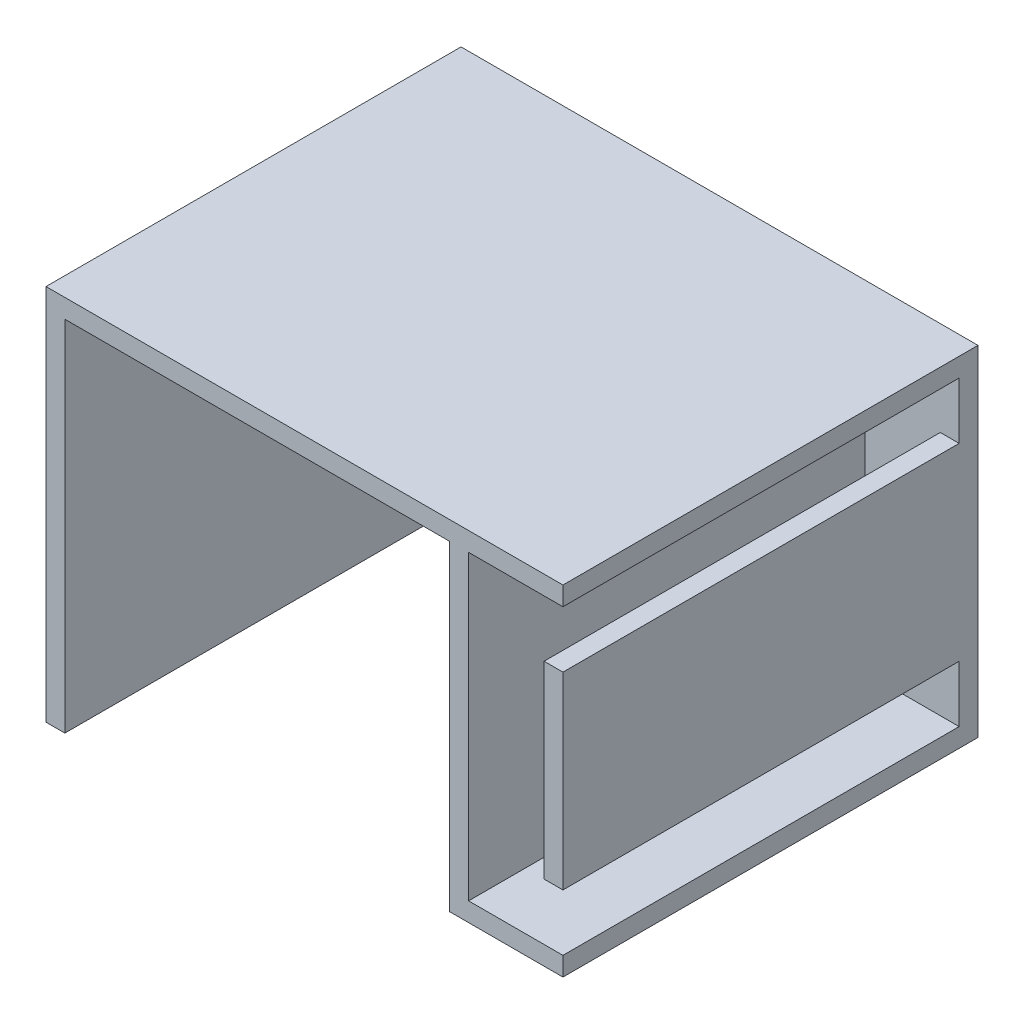
ISO-10303-21;
HEADER;
FILE_DESCRIPTION(('STEP AP214'),'2;1');
FILE_NAME('part.step','',(''),(''),'','','');
FILE_SCHEMA(('AUTOMOTIVE_DESIGN { 1 0 10303 214 1 1 1 1 }'));
ENDSEC;
DATA;
#1=APPLICATION_CONTEXT('core data for automotive mechanical design processes');
#2=APPLICATION_PROTOCOL_DEFINITION('international standard','automotive_design',2000,#1);
#3=PRODUCT_CONTEXT('',#1,'mechanical');
#4=PRODUCT('Part','Part','',(#3));
#5=PRODUCT_RELATED_PRODUCT_CATEGORY('part','',(#4));
#6=PRODUCT_DEFINITION_FORMATION('','',#4);
#7=PRODUCT_DEFINITION_CONTEXT('part definition',#1,'design');
#8=PRODUCT_DEFINITION('design','',#6,#7);
#9=PRODUCT_DEFINITION_SHAPE('','',#8);
#10=(LENGTH_UNIT() NAMED_UNIT(*) SI_UNIT(.MILLI.,.METRE.));
#11=(NAMED_UNIT(*) PLANE_ANGLE_UNIT() SI_UNIT($,.RADIAN.));
#12=(NAMED_UNIT(*) SI_UNIT($,.STERADIAN.) SOLID_ANGLE_UNIT());
#13=UNCERTAINTY_MEASURE_WITH_UNIT(LENGTH_MEASURE(1.E-05),#10,'distance_accuracy_value','');
#14=(GEOMETRIC_REPRESENTATION_CONTEXT(3) GLOBAL_UNCERTAINTY_ASSIGNED_CONTEXT((#13)) GLOBAL_UNIT_ASSIGNED_CONTEXT((#10,
#11,#12)) REPRESENTATION_CONTEXT('',''));
#15=CARTESIAN_POINT('',(0.,0.,0.));
#16=DIRECTION('',(0.,0.,1.));
#17=DIRECTION('',(1.,0.,0.));
#18=AXIS2_PLACEMENT_3D('',#15,#16,#17);
#19=CARTESIAN_POINT('',(22.4,0.,22.));
#20=DIRECTION('',(0.,0.,-1.));
#21=DIRECTION('',(1.,0.,0.));
#22=AXIS2_PLACEMENT_3D('',#19,#20,#21);
#23=PLANE('',#22);
#24=DIRECTION('',(0.,-1.,0.));
#25=VECTOR('',#24,1.);
#26=CARTESIAN_POINT('',(38.6,10.1,22.));
#27=LINE('',#26,#25);
#28=CARTESIAN_POINT('',(38.6,7.10000000000001,22.));
#29=VERTEX_POINT('',#28);
#30=CARTESIAN_POINT('',(38.6,-2.89999999999999,22.));
#31=VERTEX_POINT('',#30);
#32=EDGE_CURVE('E223',#29,#31,#27,.T.);
#33=ORIENTED_EDGE('',*,*,#32,.F.);
#34=DIRECTION('',(1.,0.,0.));
#35=VECTOR('',#34,1.);
#36=CARTESIAN_POINT('',(11.199,7.10000000000002,22.));
#37=LINE('',#36,#35);
#38=CARTESIAN_POINT('',(37.6,7.10000000000001,22.));
#39=VERTEX_POINT('',#38);
#40=EDGE_CURVE('E175',#39,#29,#37,.T.);
#41=ORIENTED_EDGE('',*,*,#40,.F.);
#42=DIRECTION('',(0.,1.,0.));
#43=VECTOR('',#42,1.);
#44=CARTESIAN_POINT('',(37.6,-5.89999999999999,22.));
#45=LINE('',#44,#43);
#46=CARTESIAN_POINT('',(37.6,-2.89999999999999,22.));
#47=VERTEX_POINT('',#46);
#48=EDGE_CURVE('E216',#47,#39,#45,.T.);
#49=ORIENTED_EDGE('',*,*,#48,.F.);
#50=DIRECTION('',(1.,0.,0.));
#51=VECTOR('',#50,1.);
#52=CARTESIAN_POINT('',(11.199,-2.89999999999999,22.));
#53=LINE('',#52,#51);
#54=EDGE_CURVE('E164',#47,#31,#53,.T.);
#55=ORIENTED_EDGE('',*,*,#54,.T.);
#56=EDGE_LOOP('',(#33,#41,#49,#55));
#57=FACE_BOUND('',#56,.T.);
#58=ADVANCED_FACE('F39',(#57),#23,.F.);
#59=CARTESIAN_POINT('',(32.6,-6.9,22.));
#60=DIRECTION('',(1.,0.,0.));
#61=DIRECTION('',(0.,-1.,0.));
#62=AXIS2_PLACEMENT_3D('',#59,#60,#61);
#63=PLANE('',#62);
#64=DIRECTION('',(0.,1.,0.));
#65=VECTOR('',#64,1.);
#66=CARTESIAN_POINT('',(32.6,-6.9,0.));
#67=LINE('',#66,#65);
#68=CARTESIAN_POINT('',(32.6,-6.9,0.));
#69=VERTEX_POINT('',#68);
#70=CARTESIAN_POINT('',(32.6,10.1,0.));
#71=VERTEX_POINT('',#70);
#72=EDGE_CURVE('E190',#69,#71,#67,.T.);
#73=ORIENTED_EDGE('',*,*,#72,.F.);
#74=DIRECTION('',(0.,0.,-1.));
#75=VECTOR('',#74,1.);
#76=CARTESIAN_POINT('',(32.6,-6.9,22.));
#77=LINE('',#76,#75);
#78=CARTESIAN_POINT('',(32.6,-6.9,22.));
#79=VERTEX_POINT('',#78);
#80=EDGE_CURVE('E225',#79,#69,#77,.T.);
#81=ORIENTED_EDGE('',*,*,#80,.F.);
#82=DIRECTION('',(0.,1.,0.));
#83=VECTOR('',#82,1.);
#84=CARTESIAN_POINT('',(32.6,-6.9,22.));
#85=LINE('',#84,#83);
#86=CARTESIAN_POINT('',(32.6,10.1,22.));
#87=VERTEX_POINT('',#86);
#88=EDGE_CURVE('E191',#79,#87,#85,.T.);
#89=ORIENTED_EDGE('',*,*,#88,.T.);
#90=DIRECTION('',(0.,0.,-1.));
#91=VECTOR('',#90,1.);
#92=CARTESIAN_POINT('',(32.6,10.1,22.));
#93=LINE('',#92,#91);
#94=EDGE_CURVE('E11',#87,#71,#93,.T.);
#95=ORIENTED_EDGE('',*,*,#94,.T.);
#96=EDGE_LOOP('',(#73,#81,#89,#95));
#97=FACE_BOUND('',#96,.T.);
#98=ADVANCED_FACE('F41',(#97),#63,.F.);
#99=CARTESIAN_POINT('',(32.6,10.1,22.));
#100=DIRECTION('',(0.,1.,0.));
#101=DIRECTION('',(0.,0.,1.));
#102=AXIS2_PLACEMENT_3D('',#99,#100,#101);
#103=PLANE('',#102);
#104=DIRECTION('',(-1.,0.,0.));
#105=VECTOR('',#104,1.);
#106=CARTESIAN_POINT('',(32.6,10.1,0.));
#107=LINE('',#106,#105);
#108=CARTESIAN_POINT('',(12.2,10.1,0.));
#109=VERTEX_POINT('',#108);
#110=EDGE_CURVE('E228',#71,#109,#107,.T.);
#111=ORIENTED_EDGE('',*,*,#110,.F.);
#112=ORIENTED_EDGE('',*,*,#94,.F.);
#113=DIRECTION('',(-1.,0.,0.));
#114=VECTOR('',#113,1.);
#115=CARTESIAN_POINT('',(32.6,10.1,22.));
#116=LINE('',#115,#114);
#117=CARTESIAN_POINT('',(12.2,10.1,22.));
#118=VERTEX_POINT('',#117);
#119=EDGE_CURVE('E194',#87,#118,#116,.T.);
#120=ORIENTED_EDGE('',*,*,#119,.T.);
#121=DIRECTION('',(0.,0.,-1.));
#122=VECTOR('',#121,1.);
#123=CARTESIAN_POINT('',(12.2,10.1,22.));
#124=LINE('',#123,#122);
#125=EDGE_CURVE('E47',#118,#109,#124,.T.);
#126=ORIENTED_EDGE('',*,*,#125,.T.);
#127=EDGE_LOOP('',(#111,#112,#120,#126));
#128=FACE_BOUND('',#127,.T.);
#129=ADVANCED_FACE('F266',(#128),#103,.F.);
#130=CARTESIAN_POINT('',(12.2,10.1,22.));
#131=DIRECTION('',(-1.,0.,0.));
#132=DIRECTION('',(0.,0.,-1.));
#133=AXIS2_PLACEMENT_3D('',#130,#131,#132);
#134=PLANE('',#133);
#135=DIRECTION('',(0.,-1.,0.));
#136=VECTOR('',#135,1.);
#137=CARTESIAN_POINT('',(12.2,10.1,0.));
#138=LINE('',#137,#136);
#139=CARTESIAN_POINT('',(12.2,-8.89999999999998,0.));
#140=VERTEX_POINT('',#139);
#141=EDGE_CURVE('E231',#109,#140,#138,.T.);
#142=ORIENTED_EDGE('',*,*,#141,.F.);
#143=ORIENTED_EDGE('',*,*,#125,.F.);
#144=DIRECTION('',(0.,-1.,0.));
#145=VECTOR('',#144,1.);
#146=CARTESIAN_POINT('',(12.2,10.1,22.));
#147=LINE('',#146,#145);
#148=CARTESIAN_POINT('',(12.2,-8.89999999999998,22.));
#149=VERTEX_POINT('',#148);
#150=EDGE_CURVE('E198',#118,#149,#147,.T.);
#151=ORIENTED_EDGE('',*,*,#150,.T.);
#152=DIRECTION('',(0.,0.,-1.));
#153=VECTOR('',#152,1.);
#154=CARTESIAN_POINT('',(12.2,-8.89999999999998,22.));
#155=LINE('',#154,#153);
#156=EDGE_CURVE('E261',#149,#140,#155,.T.);
#157=ORIENTED_EDGE('',*,*,#156,.T.);
#158=EDGE_LOOP('',(#142,#143,#151,#157));
#159=FACE_BOUND('',#158,.T.);
#160=ADVANCED_FACE('F279',(#159),#134,.F.);
#161=CARTESIAN_POINT('',(12.2,-8.89999999999998,22.));
#162=DIRECTION('',(0.,1.,0.));
#163=DIRECTION('',(0.,0.,1.));
#164=AXIS2_PLACEMENT_3D('',#161,#162,#163);
#165=PLANE('',#164);
#166=DIRECTION('',(-1.,0.,0.));
#167=VECTOR('',#166,1.);
#168=CARTESIAN_POINT('',(12.2,-8.89999999999998,0.));
#169=LINE('',#168,#167);
#170=CARTESIAN_POINT('',(11.2,-8.89999999999998,0.));
#171=VERTEX_POINT('',#170);
#172=EDGE_CURVE('E234',#140,#171,#169,.T.);
#173=ORIENTED_EDGE('',*,*,#172,.F.);
#174=ORIENTED_EDGE('',*,*,#156,.F.);
#175=DIRECTION('',(-1.,0.,0.));
#176=VECTOR('',#175,1.);
#177=CARTESIAN_POINT('',(12.2,-8.89999999999998,22.));
#178=LINE('',#177,#176);
#179=CARTESIAN_POINT('',(11.2,-8.89999999999998,22.));
#180=VERTEX_POINT('',#179);
#181=EDGE_CURVE('E201',#149,#180,#178,.T.);
#182=ORIENTED_EDGE('',*,*,#181,.T.);
#183=DIRECTION('',(0.,0.,-1.));
#184=VECTOR('',#183,1.);
#185=CARTESIAN_POINT('',(11.2,-8.89999999999998,22.));
#186=LINE('',#185,#184);
#187=EDGE_CURVE('E258',#180,#171,#186,.T.);
#188=ORIENTED_EDGE('',*,*,#187,.T.);
#189=EDGE_LOOP('',(#173,#174,#182,#188));
#190=FACE_BOUND('',#189,.T.);
#191=ADVANCED_FACE('F281',(#190),#165,.F.);
#192=CARTESIAN_POINT('',(11.2,-8.89999999999998,22.));
#193=DIRECTION('',(1.,0.,0.));
#194=DIRECTION('',(0.,-1.,0.));
#195=AXIS2_PLACEMENT_3D('',#192,#193,#194);
#196=PLANE('',#195);
#197=DIRECTION('',(0.,1.,0.));
#198=VECTOR('',#197,1.);
#199=CARTESIAN_POINT('',(11.2,-8.89999999999998,0.));
#200=LINE('',#199,#198);
#201=CARTESIAN_POINT('',(11.2,11.1,0.));
#202=VERTEX_POINT('',#201);
#203=EDGE_CURVE('E237',#171,#202,#200,.T.);
#204=ORIENTED_EDGE('',*,*,#203,.F.);
#205=ORIENTED_EDGE('',*,*,#187,.F.);
#206=DIRECTION('',(0.,1.,0.));
#207=VECTOR('',#206,1.);
#208=CARTESIAN_POINT('',(11.2,-8.89999999999998,22.));
#209=LINE('',#208,#207);
#210=CARTESIAN_POINT('',(11.2,11.1,22.));
#211=VERTEX_POINT('',#210);
#212=EDGE_CURVE('E204',#180,#211,#209,.T.);
#213=ORIENTED_EDGE('',*,*,#212,.T.);
#214=DIRECTION('',(0.,0.,-1.));
#215=VECTOR('',#214,1.);
#216=CARTESIAN_POINT('',(11.2,11.1,22.));
#217=LINE('',#216,#215);
#218=EDGE_CURVE('E255',#211,#202,#217,.T.);
#219=ORIENTED_EDGE('',*,*,#218,.T.);
#220=EDGE_LOOP('',(#204,#205,#213,#219));
#221=FACE_BOUND('',#220,.T.);
#222=ADVANCED_FACE('F284',(#221),#196,.F.);
#223=CARTESIAN_POINT('',(11.2,11.1,22.));
#224=DIRECTION('',(0.,-1.,0.));
#225=DIRECTION('',(-1.,0.,0.));
#226=AXIS2_PLACEMENT_3D('',#223,#224,#225);
#227=PLANE('',#226);
#228=DIRECTION('',(1.,0.,0.));
#229=VECTOR('',#228,1.);
#230=CARTESIAN_POINT('',(11.2,11.1,0.));
#231=LINE('',#230,#229);
#232=CARTESIAN_POINT('',(38.6,11.1,0.));
#233=VERTEX_POINT('',#232);
#234=EDGE_CURVE('E240',#202,#233,#231,.T.);
#235=ORIENTED_EDGE('',*,*,#234,.F.);
#236=ORIENTED_EDGE('',*,*,#218,.F.);
#237=DIRECTION('',(1.,0.,0.));
#238=VECTOR('',#237,1.);
#239=CARTESIAN_POINT('',(11.2,11.1,22.));
#240=LINE('',#239,#238);
#241=CARTESIAN_POINT('',(38.6,11.1,22.));
#242=VERTEX_POINT('',#241);
#243=EDGE_CURVE('E207',#211,#242,#240,.T.);
#244=ORIENTED_EDGE('',*,*,#243,.T.);
#245=DIRECTION('',(0.,0.,1.));
#246=VECTOR('',#245,1.);
#247=CARTESIAN_POINT('',(38.6,11.1,-5.09901951359278));
#248=LINE('',#247,#246);
#249=EDGE_CURVE('E184',#233,#242,#248,.T.);
#250=ORIENTED_EDGE('',*,*,#249,.F.);
#251=EDGE_LOOP('',(#235,#236,#244,#250));
#252=FACE_BOUND('',#251,.T.);
#253=ADVANCED_FACE('F287',(#252),#227,.F.);
#254=CARTESIAN_POINT('',(33.6,11.1,22.));
#255=DIRECTION('',(-1.,0.,0.));
#256=DIRECTION('',(0.,0.,-1.));
#257=AXIS2_PLACEMENT_3D('',#254,#255,#256);
#258=PLANE('',#257);
#259=DIRECTION('',(0.,-1.,0.));
#260=VECTOR('',#259,1.);
#261=CARTESIAN_POINT('',(33.6,11.1,22.));
#262=LINE('',#261,#260);
#263=CARTESIAN_POINT('',(33.6,10.1,22.));
#264=VERTEX_POINT('',#263);
#265=CARTESIAN_POINT('',(33.6,-5.89999999999999,22.));
#266=VERTEX_POINT('',#265);
#267=EDGE_CURVE('E210',#264,#266,#262,.T.);
#268=ORIENTED_EDGE('',*,*,#267,.T.);
#269=DIRECTION('',(0.,0.,-1.));
#270=VECTOR('',#269,1.);
#271=CARTESIAN_POINT('',(33.6,-5.89999999999999,22.));
#272=LINE('',#271,#270);
#273=CARTESIAN_POINT('',(33.6,-5.89999999999999,1.));
#274=VERTEX_POINT('',#273);
#275=EDGE_CURVE('E252',#266,#274,#272,.T.);
#276=ORIENTED_EDGE('',*,*,#275,.T.);
#277=DIRECTION('',(0.,-1.,0.));
#278=VECTOR('',#277,1.);
#279=CARTESIAN_POINT('',(33.6,10.1,1.));
#280=LINE('',#279,#278);
#281=CARTESIAN_POINT('',(33.6,10.1,0.999999999999998));
#282=VERTEX_POINT('',#281);
#283=EDGE_CURVE('E182',#282,#274,#280,.T.);
#284=ORIENTED_EDGE('',*,*,#283,.F.);
#285=DIRECTION('',(0.,0.,1.));
#286=VECTOR('',#285,1.);
#287=CARTESIAN_POINT('',(33.6,10.1,-5.09901951359278));
#288=LINE('',#287,#286);
#289=EDGE_CURVE('E180',#282,#264,#288,.T.);
#290=ORIENTED_EDGE('',*,*,#289,.T.);
#291=EDGE_LOOP('',(#268,#276,#284,#290));
#292=FACE_BOUND('',#291,.T.);
#293=ADVANCED_FACE('F325',(#292),#258,.F.);
#294=CARTESIAN_POINT('',(33.6,-5.89999999999999,22.));
#295=DIRECTION('',(0.,-1.,0.));
#296=DIRECTION('',(-1.,0.,0.));
#297=AXIS2_PLACEMENT_3D('',#294,#295,#296);
#298=PLANE('',#297);
#299=ORIENTED_EDGE('',*,*,#275,.F.);
#300=DIRECTION('',(1.,0.,0.));
#301=VECTOR('',#300,1.);
#302=CARTESIAN_POINT('',(33.6,-5.89999999999999,22.));
#303=LINE('',#302,#301);
#304=CARTESIAN_POINT('',(38.6,-5.9,22.));
#305=VERTEX_POINT('',#304);
#306=EDGE_CURVE('E213',#266,#305,#303,.T.);
#307=ORIENTED_EDGE('',*,*,#306,.T.);
#308=DIRECTION('',(0.,0.,1.));
#309=VECTOR('',#308,1.);
#310=CARTESIAN_POINT('',(38.6,-5.9,1.));
#311=LINE('',#310,#309);
#312=CARTESIAN_POINT('',(38.6,-5.9,1.));
#313=VERTEX_POINT('',#312);
#314=EDGE_CURVE('E165',#313,#305,#311,.T.);
#315=ORIENTED_EDGE('',*,*,#314,.F.);
#316=DIRECTION('',(1.,0.,0.));
#317=VECTOR('',#316,1.);
#318=CARTESIAN_POINT('',(37.6,-5.89999999999999,1.));
#319=LINE('',#318,#317);
#320=EDGE_CURVE('E62',#274,#313,#319,.T.);
#321=ORIENTED_EDGE('',*,*,#320,.F.);
#322=EDGE_LOOP('',(#299,#307,#315,#321));
#323=FACE_BOUND('',#322,.T.);
#324=ADVANCED_FACE('F312',(#323),#298,.F.);
#325=CARTESIAN_POINT('',(37.6,-5.89999999999999,22.));
#326=DIRECTION('',(1.,0.,0.));
#327=DIRECTION('',(0.,-1.,0.));
#328=AXIS2_PLACEMENT_3D('',#325,#326,#327);
#329=PLANE('',#328);
#330=ORIENTED_EDGE('',*,*,#48,.T.);
#331=DIRECTION('',(0.,0.,-1.));
#332=VECTOR('',#331,1.);
#333=CARTESIAN_POINT('',(37.6,7.10000000000001,22.));
#334=LINE('',#333,#332);
#335=CARTESIAN_POINT('',(37.6,7.10000000000001,1.));
#336=VERTEX_POINT('',#335);
#337=EDGE_CURVE('E178',#39,#336,#334,.T.);
#338=ORIENTED_EDGE('',*,*,#337,.T.);
#339=DIRECTION('',(0.,1.,0.));
#340=VECTOR('',#339,1.);
#341=CARTESIAN_POINT('',(37.6,10.1,1.));
#342=LINE('',#341,#340);
#343=CARTESIAN_POINT('',(37.6,-2.89999999999999,1.));
#344=VERTEX_POINT('',#343);
#345=EDGE_CURVE('E159',#344,#336,#342,.T.);
#346=ORIENTED_EDGE('',*,*,#345,.F.);
#347=DIRECTION('',(0.,0.,1.));
#348=VECTOR('',#347,1.);
#349=CARTESIAN_POINT('',(37.6,-2.89999999999999,1.));
#350=LINE('',#349,#348);
#351=EDGE_CURVE('E168',#344,#47,#350,.T.);
#352=ORIENTED_EDGE('',*,*,#351,.T.);
#353=EDGE_LOOP('',(#330,#338,#346,#352));
#354=FACE_BOUND('',#353,.T.);
#355=ADVANCED_FACE('F177',(#354),#329,.F.);
#356=CARTESIAN_POINT('',(38.6,10.1,22.));
#357=DIRECTION('',(-1.,0.,0.));
#358=DIRECTION('',(0.,0.,-1.));
#359=AXIS2_PLACEMENT_3D('',#356,#357,#358);
#360=PLANE('',#359);
#361=DIRECTION('',(0.,-1.,0.));
#362=VECTOR('',#361,1.);
#363=CARTESIAN_POINT('',(38.6,-5.9,1.));
#364=LINE('',#363,#362);
#365=CARTESIAN_POINT('',(38.6,-2.89999999999999,1.));
#366=VERTEX_POINT('',#365);
#367=EDGE_CURVE('E161',#366,#313,#364,.T.);
#368=ORIENTED_EDGE('',*,*,#367,.T.);
#369=ORIENTED_EDGE('',*,*,#314,.T.);
#370=CARTESIAN_POINT('',(38.6,-6.90000000000001,22.));
#371=VERTEX_POINT('',#370);
#372=EDGE_CURVE('E218',#305,#371,#27,.T.);
#373=ORIENTED_EDGE('',*,*,#372,.T.);
#374=DIRECTION('',(0.,0.,-1.));
#375=VECTOR('',#374,1.);
#376=CARTESIAN_POINT('',(38.6,-6.90000000000001,22.));
#377=LINE('',#376,#375);
#378=CARTESIAN_POINT('',(38.6,-6.90000000000001,0.));
#379=VERTEX_POINT('',#378);
#380=EDGE_CURVE('E249',#371,#379,#377,.T.);
#381=ORIENTED_EDGE('',*,*,#380,.T.);
#382=DIRECTION('',(0.,-1.,0.));
#383=VECTOR('',#382,1.);
#384=CARTESIAN_POINT('',(38.6,10.1,0.));
#385=LINE('',#384,#383);
#386=EDGE_CURVE('E243',#233,#379,#385,.T.);
#387=ORIENTED_EDGE('',*,*,#386,.F.);
#388=ORIENTED_EDGE('',*,*,#249,.T.);
#389=CARTESIAN_POINT('',(38.6,10.1,22.));
#390=VERTEX_POINT('',#389);
#391=EDGE_CURVE('E219',#242,#390,#27,.T.);
#392=ORIENTED_EDGE('',*,*,#391,.T.);
#393=DIRECTION('',(0.,0.,-1.));
#394=VECTOR('',#393,1.);
#395=CARTESIAN_POINT('',(38.6,10.1,22.));
#396=LINE('',#395,#394);
#397=CARTESIAN_POINT('',(38.6,10.1,1.));
#398=VERTEX_POINT('',#397);
#399=EDGE_CURVE('E300',#390,#398,#396,.T.);
#400=ORIENTED_EDGE('',*,*,#399,.T.);
#401=DIRECTION('',(0.,-1.,0.));
#402=VECTOR('',#401,1.);
#403=CARTESIAN_POINT('',(38.6,10.1,1.));
#404=LINE('',#403,#402);
#405=CARTESIAN_POINT('',(38.6,7.10000000000001,1.));
#406=VERTEX_POINT('',#405);
#407=EDGE_CURVE('E303',#398,#406,#404,.T.);
#408=ORIENTED_EDGE('',*,*,#407,.T.);
#409=DIRECTION('',(0.,0.,1.));
#410=VECTOR('',#409,1.);
#411=CARTESIAN_POINT('',(38.6,7.10000000000001,22.));
#412=LINE('',#411,#410);
#413=EDGE_CURVE('E296',#406,#29,#412,.T.);
#414=ORIENTED_EDGE('',*,*,#413,.T.);
#415=ORIENTED_EDGE('',*,*,#32,.T.);
#416=DIRECTION('',(0.,0.,-1.));
#417=VECTOR('',#416,1.);
#418=CARTESIAN_POINT('',(38.6,-2.89999999999999,1.));
#419=LINE('',#418,#417);
#420=EDGE_CURVE('E174',#31,#366,#419,.T.);
#421=ORIENTED_EDGE('',*,*,#420,.T.);
#422=EDGE_LOOP('',(#368,#369,#373,#381,#387,#388,#392,#400,#408,#414,#415,#421));
#423=FACE_BOUND('',#422,.T.);
#424=ADVANCED_FACE('F311',(#423),#360,.F.);
#425=CARTESIAN_POINT('',(32.6,-6.9,22.));
#426=DIRECTION('',(0.,1.,0.));
#427=DIRECTION('',(1.,0.,0.));
#428=AXIS2_PLACEMENT_3D('',#425,#426,#427);
#429=PLANE('',#428);
#430=DIRECTION('',(-1.,0.,0.));
#431=VECTOR('',#430,1.);
#432=CARTESIAN_POINT('',(32.6,-6.9,0.));
#433=LINE('',#432,#431);
#434=EDGE_CURVE('E195',#379,#69,#433,.T.);
#435=ORIENTED_EDGE('',*,*,#434,.F.);
#436=ORIENTED_EDGE('',*,*,#380,.F.);
#437=DIRECTION('',(-1.,0.,0.));
#438=VECTOR('',#437,1.);
#439=CARTESIAN_POINT('',(32.6,-6.9,22.));
#440=LINE('',#439,#438);
#441=EDGE_CURVE('E222',#371,#79,#440,.T.);
#442=ORIENTED_EDGE('',*,*,#441,.T.);
#443=ORIENTED_EDGE('',*,*,#80,.T.);
#444=EDGE_LOOP('',(#435,#436,#442,#443));
#445=FACE_BOUND('',#444,.T.);
#446=ADVANCED_FACE('F342',(#445),#429,.F.);
#447=ORIENTED_EDGE('',*,*,#306,.F.);
#448=ORIENTED_EDGE('',*,*,#267,.F.);
#449=DIRECTION('',(-1.,0.,0.));
#450=VECTOR('',#449,1.);
#451=CARTESIAN_POINT('',(33.6,10.1,22.));
#452=LINE('',#451,#450);
#453=EDGE_CURVE('E54',#390,#264,#452,.T.);
#454=ORIENTED_EDGE('',*,*,#453,.F.);
#455=ORIENTED_EDGE('',*,*,#391,.F.);
#456=ORIENTED_EDGE('',*,*,#243,.F.);
#457=ORIENTED_EDGE('',*,*,#212,.F.);
#458=ORIENTED_EDGE('',*,*,#181,.F.);
#459=ORIENTED_EDGE('',*,*,#150,.F.);
#460=ORIENTED_EDGE('',*,*,#119,.F.);
#461=ORIENTED_EDGE('',*,*,#88,.F.);
#462=ORIENTED_EDGE('',*,*,#441,.F.);
#463=ORIENTED_EDGE('',*,*,#372,.F.);
#464=EDGE_LOOP('',(#447,#448,#454,#455,#456,#457,#458,#459,#460,#461,#462,#463));
#465=FACE_BOUND('',#464,.T.);
#466=ADVANCED_FACE('F276',(#465),#23,.F.);
#467=CARTESIAN_POINT('',(22.4,0.,0.));
#468=DIRECTION('',(0.,0.,-1.));
#469=DIRECTION('',(1.,0.,0.));
#470=AXIS2_PLACEMENT_3D('',#467,#468,#469);
#471=PLANE('',#470);
#472=ORIENTED_EDGE('',*,*,#386,.T.);
#473=ORIENTED_EDGE('',*,*,#434,.T.);
#474=ORIENTED_EDGE('',*,*,#72,.T.);
#475=ORIENTED_EDGE('',*,*,#110,.T.);
#476=ORIENTED_EDGE('',*,*,#141,.T.);
#477=ORIENTED_EDGE('',*,*,#172,.T.);
#478=ORIENTED_EDGE('',*,*,#203,.T.);
#479=ORIENTED_EDGE('',*,*,#234,.T.);
#480=EDGE_LOOP('',(#472,#473,#474,#475,#476,#477,#478,#479));
#481=FACE_BOUND('',#480,.T.);
#482=ADVANCED_FACE('F270',(#481),#471,.T.);
#483=CARTESIAN_POINT('',(22.4,0.,1.));
#484=DIRECTION('',(0.,0.,1.));
#485=DIRECTION('',(-1.,0.,0.));
#486=AXIS2_PLACEMENT_3D('',#483,#484,#485);
#487=PLANE('',#486);
#488=ORIENTED_EDGE('',*,*,#345,.T.);
#489=DIRECTION('',(1.,0.,0.));
#490=VECTOR('',#489,1.);
#491=CARTESIAN_POINT('',(11.199,7.10000000000001,1.));
#492=LINE('',#491,#490);
#493=EDGE_CURVE('E294',#336,#406,#492,.T.);
#494=ORIENTED_EDGE('',*,*,#493,.T.);
#495=ORIENTED_EDGE('',*,*,#407,.F.);
#496=DIRECTION('',(-1.,0.,0.));
#497=VECTOR('',#496,1.);
#498=CARTESIAN_POINT('',(37.6,10.1,1.));
#499=LINE('',#498,#497);
#500=EDGE_CURVE('E179',#398,#282,#499,.T.);
#501=ORIENTED_EDGE('',*,*,#500,.T.);
#502=ORIENTED_EDGE('',*,*,#283,.T.);
#503=ORIENTED_EDGE('',*,*,#320,.T.);
#504=ORIENTED_EDGE('',*,*,#367,.F.);
#505=DIRECTION('',(1.,0.,0.));
#506=VECTOR('',#505,1.);
#507=CARTESIAN_POINT('',(11.199,-2.89999999999999,1.));
#508=LINE('',#507,#506);
#509=EDGE_CURVE('E155',#344,#366,#508,.T.);
#510=ORIENTED_EDGE('',*,*,#509,.F.);
#511=EDGE_LOOP('',(#488,#494,#495,#501,#502,#503,#504,#510));
#512=FACE_BOUND('',#511,.T.);
#513=ADVANCED_FACE('F157',(#512),#487,.T.);
#514=CARTESIAN_POINT('',(33.6,10.1,-5.09901951359278));
#515=DIRECTION('',(0.,-1.,0.));
#516=DIRECTION('',(0.,0.,-1.));
#517=AXIS2_PLACEMENT_3D('',#514,#515,#516);
#518=PLANE('',#517);
#519=ORIENTED_EDGE('',*,*,#453,.T.);
#520=ORIENTED_EDGE('',*,*,#289,.F.);
#521=ORIENTED_EDGE('',*,*,#500,.F.);
#522=ORIENTED_EDGE('',*,*,#399,.F.);
#523=EDGE_LOOP('',(#519,#520,#521,#522));
#524=FACE_BOUND('',#523,.T.);
#525=ADVANCED_FACE('F322',(#524),#518,.T.);
#526=CARTESIAN_POINT('',(11.199,7.10000000000002,22.));
#527=DIRECTION('',(0.,-1.,0.));
#528=DIRECTION('',(0.,0.,-1.));
#529=AXIS2_PLACEMENT_3D('',#526,#527,#528);
#530=PLANE('',#529);
#531=ORIENTED_EDGE('',*,*,#337,.F.);
#532=ORIENTED_EDGE('',*,*,#40,.T.);
#533=ORIENTED_EDGE('',*,*,#413,.F.);
#534=ORIENTED_EDGE('',*,*,#493,.F.);
#535=EDGE_LOOP('',(#531,#532,#533,#534));
#536=FACE_BOUND('',#535,.T.);
#537=ADVANCED_FACE('F320',(#536),#530,.F.);
#538=CARTESIAN_POINT('',(11.199,-2.89999999999999,1.));
#539=DIRECTION('',(0.,1.,0.));
#540=DIRECTION('',(1.,0.,0.));
#541=AXIS2_PLACEMENT_3D('',#538,#539,#540);
#542=PLANE('',#541);
#543=ORIENTED_EDGE('',*,*,#351,.F.);
#544=ORIENTED_EDGE('',*,*,#509,.T.);
#545=ORIENTED_EDGE('',*,*,#420,.F.);
#546=ORIENTED_EDGE('',*,*,#54,.F.);
#547=EDGE_LOOP('',(#543,#544,#545,#546));
#548=FACE_BOUND('',#547,.T.);
#549=ADVANCED_FACE('F169',(#548),#542,.F.);
#550=CLOSED_SHELL('',(#58,#98,#129,#160,#191,#222,#253,#293,#324,#355,#424,#446,#466,#482,#513,
#525,#537,#549));
#551=MANIFOLD_SOLID_BREP('B2',#550);
#552=ADVANCED_BREP_SHAPE_REPRESENTATION('',(#18,#551),#14);
#553=SHAPE_DEFINITION_REPRESENTATION(#9,#552);
ENDSEC;
END-ISO-10303-21;
